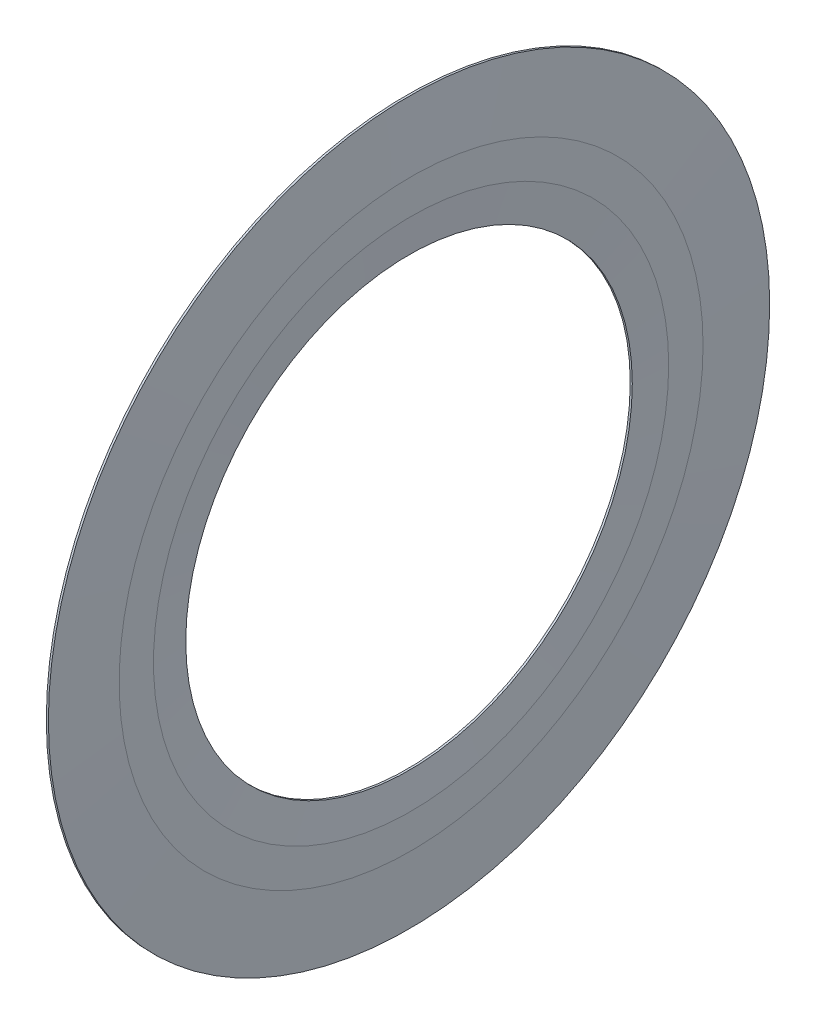
ISO-10303-21;
HEADER;
FILE_DESCRIPTION(('STEP AP214'),'2;1');
FILE_NAME('part.step','',(''),(''),'','','');
FILE_SCHEMA(('AUTOMOTIVE_DESIGN { 1 0 10303 214 1 1 1 1 }'));
ENDSEC;
DATA;
#1=APPLICATION_CONTEXT('core data for automotive mechanical design processes');
#2=APPLICATION_PROTOCOL_DEFINITION('international standard','automotive_design',2000,#1);
#3=PRODUCT_CONTEXT('',#1,'mechanical');
#4=PRODUCT('Part','Part','',(#3));
#5=PRODUCT_RELATED_PRODUCT_CATEGORY('part','',(#4));
#6=PRODUCT_DEFINITION_FORMATION('','',#4);
#7=PRODUCT_DEFINITION_CONTEXT('part definition',#1,'design');
#8=PRODUCT_DEFINITION('design','',#6,#7);
#9=PRODUCT_DEFINITION_SHAPE('','',#8);
#10=(LENGTH_UNIT() NAMED_UNIT(*) SI_UNIT(.MILLI.,.METRE.));
#11=(NAMED_UNIT(*) PLANE_ANGLE_UNIT() SI_UNIT($,.RADIAN.));
#12=(NAMED_UNIT(*) SI_UNIT($,.STERADIAN.) SOLID_ANGLE_UNIT());
#13=UNCERTAINTY_MEASURE_WITH_UNIT(LENGTH_MEASURE(1.E-05),#10,'distance_accuracy_value','');
#14=(GEOMETRIC_REPRESENTATION_CONTEXT(3) GLOBAL_UNCERTAINTY_ASSIGNED_CONTEXT((#13)) GLOBAL_UNIT_ASSIGNED_CONTEXT((#10,
#11,#12)) REPRESENTATION_CONTEXT('',''));
#15=CARTESIAN_POINT('',(0.,0.,0.));
#16=DIRECTION('',(0.,0.,1.));
#17=DIRECTION('',(1.,0.,0.));
#18=AXIS2_PLACEMENT_3D('',#15,#16,#17);
#19=CARTESIAN_POINT('',(-4.,10.5,0.));
#20=DIRECTION('',(-1.,0.,0.));
#21=DIRECTION('',(0.,0.,1.));
#22=AXIS2_PLACEMENT_3D('',#19,#20,#21);
#23=PLANE('',#22);
#24=CARTESIAN_POINT('',(-4.,0.,0.));
#25=DIRECTION('',(1.,0.,0.));
#26=DIRECTION('',(0.,0.,-1.));
#27=AXIS2_PLACEMENT_3D('',#24,#25,#26);
#28=CIRCLE('',#27,8.5);
#29=CARTESIAN_POINT('',(-4.,0.,-8.5));
#30=VERTEX_POINT('',#29);
#31=EDGE_CURVE('E44',#30,#30,#28,.T.);
#32=ORIENTED_EDGE('',*,*,#31,.T.);
#33=EDGE_LOOP('',(#32));
#34=FACE_BOUND('',#33,.T.);
#35=CARTESIAN_POINT('',(-4.,0.,0.));
#36=DIRECTION('',(1.,0.,0.));
#37=DIRECTION('',(0.,0.,-1.));
#38=AXIS2_PLACEMENT_3D('',#35,#36,#37);
#39=CIRCLE('',#38,10.5);
#40=CARTESIAN_POINT('',(-4.,0.,-10.5));
#41=VERTEX_POINT('',#40);
#42=EDGE_CURVE('E41',#41,#41,#39,.T.);
#43=ORIENTED_EDGE('',*,*,#42,.F.);
#44=EDGE_LOOP('',(#43));
#45=FACE_BOUND('',#44,.T.);
#46=ADVANCED_FACE('F15',(#34,#45),#23,.T.);
#47=CARTESIAN_POINT('',(-4.,0.,0.));
#48=DIRECTION('',(-1.,0.,0.));
#49=DIRECTION('',(0.,0.,1.));
#50=AXIS2_PLACEMENT_3D('',#47,#48,#49);
#51=CONICAL_SURFACE('',#50,8.5,1.54080532193802);
#52=CARTESIAN_POINT('',(-3.97,0.,0.));
#53=DIRECTION('',(1.,0.,0.));
#54=DIRECTION('',(0.,0.,-1.));
#55=AXIS2_PLACEMENT_3D('',#52,#53,#54);
#56=CIRCLE('',#55,7.5);
#57=CARTESIAN_POINT('',(-3.97,0.,-7.5));
#58=VERTEX_POINT('',#57);
#59=EDGE_CURVE('E38',#58,#58,#56,.T.);
#60=ORIENTED_EDGE('',*,*,#59,.T.);
#61=EDGE_LOOP('',(#60));
#62=FACE_BOUND('',#61,.T.);
#63=ORIENTED_EDGE('',*,*,#31,.F.);
#64=EDGE_LOOP('',(#63));
#65=FACE_BOUND('',#64,.T.);
#66=ADVANCED_FACE('F50',(#62,#65),#51,.F.);
#67=CARTESIAN_POINT('',(0.5,0.,0.));
#68=DIRECTION('',(1.,0.,0.));
#69=DIRECTION('',(0.,0.,-1.));
#70=AXIS2_PLACEMENT_3D('',#67,#68,#69);
#71=CYLINDRICAL_SURFACE('',#70,10.5);
#72=ORIENTED_EDGE('',*,*,#42,.T.);
#73=EDGE_LOOP('',(#72));
#74=FACE_BOUND('',#73,.T.);
#75=CARTESIAN_POINT('',(-3.94,0.,0.));
#76=DIRECTION('',(1.,0.,0.));
#77=DIRECTION('',(0.,0.,-1.));
#78=AXIS2_PLACEMENT_3D('',#75,#76,#77);
#79=CIRCLE('',#78,10.5);
#80=CARTESIAN_POINT('',(-3.94,0.,-10.5));
#81=VERTEX_POINT('',#80);
#82=EDGE_CURVE('E35',#81,#81,#79,.T.);
#83=ORIENTED_EDGE('',*,*,#82,.F.);
#84=EDGE_LOOP('',(#83));
#85=FACE_BOUND('',#84,.T.);
#86=ADVANCED_FACE('F52',(#74,#85),#71,.T.);
#87=CARTESIAN_POINT('',(-3.97,0.,0.));
#88=DIRECTION('',(1.,0.,0.));
#89=DIRECTION('',(0.,0.,-1.));
#90=AXIS2_PLACEMENT_3D('',#87,#88,#89);
#91=CONICAL_SURFACE('',#90,7.5,1.54080532193802);
#92=CARTESIAN_POINT('',(-4.,0.,0.));
#93=DIRECTION('',(1.,0.,0.));
#94=DIRECTION('',(0.,0.,-1.));
#95=AXIS2_PLACEMENT_3D('',#92,#93,#94);
#96=CIRCLE('',#95,6.5);
#97=CARTESIAN_POINT('',(-4.,0.,-6.5));
#98=VERTEX_POINT('',#97);
#99=EDGE_CURVE('E30',#98,#98,#96,.T.);
#100=ORIENTED_EDGE('',*,*,#99,.T.);
#101=EDGE_LOOP('',(#100));
#102=FACE_BOUND('',#101,.T.);
#103=ORIENTED_EDGE('',*,*,#59,.F.);
#104=EDGE_LOOP('',(#103));
#105=FACE_BOUND('',#104,.T.);
#106=ADVANCED_FACE('F60',(#102,#105),#91,.T.);
#107=CARTESIAN_POINT('',(-3.88,0.,0.));
#108=DIRECTION('',(-1.,0.,0.));
#109=DIRECTION('',(0.,0.,1.));
#110=AXIS2_PLACEMENT_3D('',#107,#108,#109);
#111=CONICAL_SURFACE('',#110,8.5,1.54080532193802);
#112=ORIENTED_EDGE('',*,*,#82,.T.);
#113=EDGE_LOOP('',(#112));
#114=FACE_BOUND('',#113,.T.);
#115=CARTESIAN_POINT('',(-3.88,0.,0.));
#116=DIRECTION('',(1.,0.,0.));
#117=DIRECTION('',(0.,0.,-1.));
#118=AXIS2_PLACEMENT_3D('',#115,#116,#117);
#119=CIRCLE('',#118,8.5);
#120=CARTESIAN_POINT('',(-3.88,0.,-8.5));
#121=VERTEX_POINT('',#120);
#122=EDGE_CURVE('E26',#121,#121,#119,.T.);
#123=ORIENTED_EDGE('',*,*,#122,.F.);
#124=EDGE_LOOP('',(#123));
#125=FACE_BOUND('',#124,.T.);
#126=ADVANCED_FACE('F67',(#114,#125),#111,.T.);
#127=CARTESIAN_POINT('',(0.5,0.,0.));
#128=DIRECTION('',(1.,0.,0.));
#129=DIRECTION('',(0.,0.,-1.));
#130=AXIS2_PLACEMENT_3D('',#127,#128,#129);
#131=CYLINDRICAL_SURFACE('',#130,6.5);
#132=CARTESIAN_POINT('',(-3.94,0.,0.));
#133=DIRECTION('',(1.,0.,0.));
#134=DIRECTION('',(0.,0.,-1.));
#135=AXIS2_PLACEMENT_3D('',#132,#133,#134);
#136=CIRCLE('',#135,6.5);
#137=CARTESIAN_POINT('',(-3.94,0.,-6.5));
#138=VERTEX_POINT('',#137);
#139=EDGE_CURVE('E22',#138,#138,#136,.T.);
#140=ORIENTED_EDGE('',*,*,#139,.T.);
#141=EDGE_LOOP('',(#140));
#142=FACE_BOUND('',#141,.T.);
#143=ORIENTED_EDGE('',*,*,#99,.F.);
#144=EDGE_LOOP('',(#143));
#145=FACE_BOUND('',#144,.T.);
#146=ADVANCED_FACE('F71',(#142,#145),#131,.F.);
#147=CARTESIAN_POINT('',(-3.88,7.5,0.));
#148=DIRECTION('',(1.,0.,0.));
#149=DIRECTION('',(0.,0.,-1.));
#150=AXIS2_PLACEMENT_3D('',#147,#148,#149);
#151=PLANE('',#150);
#152=ORIENTED_EDGE('',*,*,#122,.T.);
#153=EDGE_LOOP('',(#152));
#154=FACE_BOUND('',#153,.T.);
#155=CARTESIAN_POINT('',(-3.88,0.,0.));
#156=DIRECTION('',(1.,0.,0.));
#157=DIRECTION('',(0.,0.,-1.));
#158=AXIS2_PLACEMENT_3D('',#155,#156,#157);
#159=CIRCLE('',#158,7.50000000000001);
#160=CARTESIAN_POINT('',(-3.88,0.,-7.50000000000001));
#161=VERTEX_POINT('',#160);
#162=EDGE_CURVE('E10',#161,#161,#159,.T.);
#163=ORIENTED_EDGE('',*,*,#162,.F.);
#164=EDGE_LOOP('',(#163));
#165=FACE_BOUND('',#164,.T.);
#166=ADVANCED_FACE('F74',(#154,#165),#151,.T.);
#167=CARTESIAN_POINT('',(-3.94,0.,0.));
#168=DIRECTION('',(1.,0.,0.));
#169=DIRECTION('',(0.,0.,-1.));
#170=AXIS2_PLACEMENT_3D('',#167,#168,#169);
#171=CONICAL_SURFACE('',#170,6.5,1.51086817167369);
#172=ORIENTED_EDGE('',*,*,#162,.T.);
#173=EDGE_LOOP('',(#172));
#174=FACE_BOUND('',#173,.T.);
#175=ORIENTED_EDGE('',*,*,#139,.F.);
#176=EDGE_LOOP('',(#175));
#177=FACE_BOUND('',#176,.T.);
#178=ADVANCED_FACE('F17',(#174,#177),#171,.F.);
#179=CLOSED_SHELL('',(#46,#66,#86,#106,#126,#146,#166,#178));
#180=MANIFOLD_SOLID_BREP('B1',#179);
#181=ADVANCED_BREP_SHAPE_REPRESENTATION('',(#18,#180),#14);
#182=SHAPE_DEFINITION_REPRESENTATION(#9,#181);
ENDSEC;
END-ISO-10303-21;
